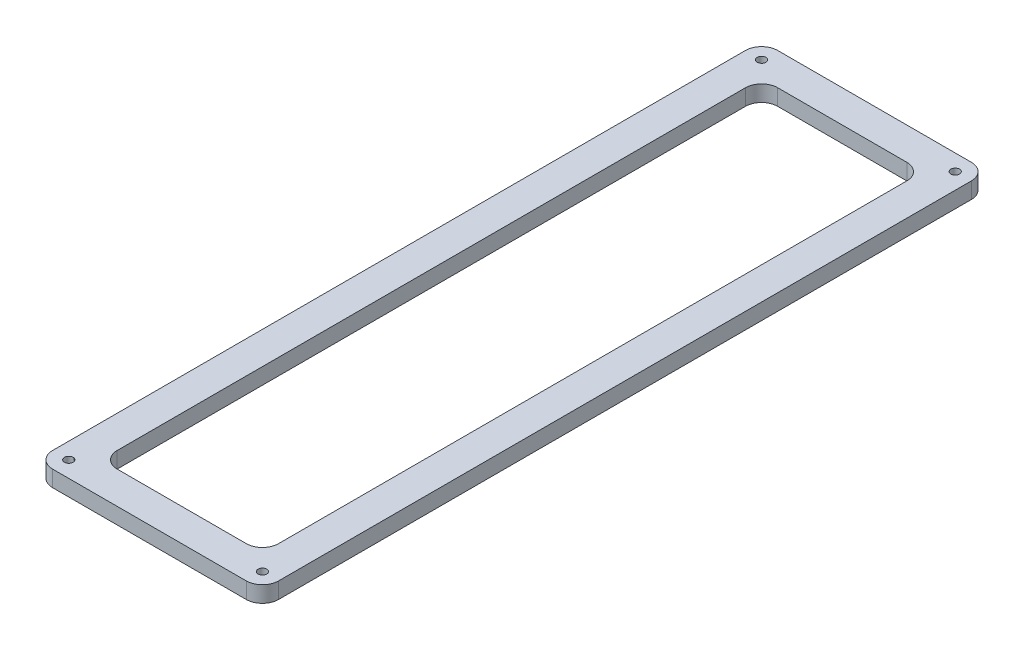
ISO-10303-21;
HEADER;
FILE_DESCRIPTION(('STEP AP214'),'2;1');
FILE_NAME('part.step','',(''),(''),'','','');
FILE_SCHEMA(('AUTOMOTIVE_DESIGN { 1 0 10303 214 1 1 1 1 }'));
ENDSEC;
DATA;
#1=APPLICATION_CONTEXT('core data for automotive mechanical design processes');
#2=APPLICATION_PROTOCOL_DEFINITION('international standard','automotive_design',2000,#1);
#3=PRODUCT_CONTEXT('',#1,'mechanical');
#4=PRODUCT('Part','Part','',(#3));
#5=PRODUCT_RELATED_PRODUCT_CATEGORY('part','',(#4));
#6=PRODUCT_DEFINITION_FORMATION('','',#4);
#7=PRODUCT_DEFINITION_CONTEXT('part definition',#1,'design');
#8=PRODUCT_DEFINITION('design','',#6,#7);
#9=PRODUCT_DEFINITION_SHAPE('','',#8);
#10=(LENGTH_UNIT() NAMED_UNIT(*) SI_UNIT(.MILLI.,.METRE.));
#11=(NAMED_UNIT(*) PLANE_ANGLE_UNIT() SI_UNIT($,.RADIAN.));
#12=(NAMED_UNIT(*) SI_UNIT($,.STERADIAN.) SOLID_ANGLE_UNIT());
#13=UNCERTAINTY_MEASURE_WITH_UNIT(LENGTH_MEASURE(1.E-05),#10,'distance_accuracy_value','');
#14=(GEOMETRIC_REPRESENTATION_CONTEXT(3) GLOBAL_UNCERTAINTY_ASSIGNED_CONTEXT((#13)) GLOBAL_UNIT_ASSIGNED_CONTEXT((#10,
#11,#12)) REPRESENTATION_CONTEXT('',''));
#15=CARTESIAN_POINT('',(0.,0.,0.));
#16=DIRECTION('',(0.,0.,1.));
#17=DIRECTION('',(1.,0.,0.));
#18=AXIS2_PLACEMENT_3D('',#15,#16,#17);
#19=CARTESIAN_POINT('',(0.,3.175,-136.313672));
#20=DIRECTION('',(0.,1.,0.));
#21=DIRECTION('',(0.,0.,1.));
#22=AXIS2_PLACEMENT_3D('',#19,#20,#21);
#23=PLANE('',#22);
#24=DIRECTION('',(-1.,0.,0.));
#25=VECTOR('',#24,1.);
#26=CARTESIAN_POINT('',(6.34999999999998,3.175,-133.138672));
#27=LINE('',#26,#25);
#28=CARTESIAN_POINT('',(31.75,3.175,-133.138672));
#29=VERTEX_POINT('',#28);
#30=CARTESIAN_POINT('',(6.34999999999998,3.175,-133.138672));
#31=VERTEX_POINT('',#30);
#32=EDGE_CURVE('E168',#29,#31,#27,.T.);
#33=ORIENTED_EDGE('',*,*,#32,.F.);
#34=CARTESIAN_POINT('',(31.75,3.175,-129.963672));
#35=DIRECTION('',(0.,1.,0.));
#36=DIRECTION('',(0.,0.,-1.));
#37=AXIS2_PLACEMENT_3D('',#34,#35,#36);
#38=CIRCLE('',#37,3.17500000000001);
#39=CARTESIAN_POINT('',(34.925,3.175,-129.963672));
#40=VERTEX_POINT('',#39);
#41=EDGE_CURVE('E159',#40,#29,#38,.T.);
#42=ORIENTED_EDGE('',*,*,#41,.F.);
#43=DIRECTION('',(0.,0.,-1.));
#44=VECTOR('',#43,1.);
#45=CARTESIAN_POINT('',(34.925,3.175,-129.963672));
#46=LINE('',#45,#44);
#47=CARTESIAN_POINT('',(34.925,3.175,-6.34999999999999));
#48=VERTEX_POINT('',#47);
#49=EDGE_CURVE('E202',#48,#40,#46,.T.);
#50=ORIENTED_EDGE('',*,*,#49,.F.);
#51=CARTESIAN_POINT('',(31.75,3.175,-6.35));
#52=DIRECTION('',(0.,1.,0.));
#53=DIRECTION('',(0.,0.,-1.));
#54=AXIS2_PLACEMENT_3D('',#51,#52,#53);
#55=CIRCLE('',#54,3.175);
#56=CARTESIAN_POINT('',(31.75,3.175,-3.175));
#57=VERTEX_POINT('',#56);
#58=EDGE_CURVE('E199',#57,#48,#55,.T.);
#59=ORIENTED_EDGE('',*,*,#58,.F.);
#60=DIRECTION('',(1.,0.,0.));
#61=VECTOR('',#60,1.);
#62=CARTESIAN_POINT('',(31.75,3.175,-3.175));
#63=LINE('',#62,#61);
#64=CARTESIAN_POINT('',(6.34999999999998,3.175,-3.175));
#65=VERTEX_POINT('',#64);
#66=EDGE_CURVE('E196',#65,#57,#63,.T.);
#67=ORIENTED_EDGE('',*,*,#66,.F.);
#68=CARTESIAN_POINT('',(6.34999999999998,3.175,-6.35));
#69=DIRECTION('',(0.,1.,0.));
#70=DIRECTION('',(0.,0.,-1.));
#71=AXIS2_PLACEMENT_3D('',#68,#69,#70);
#72=CIRCLE('',#71,3.175);
#73=CARTESIAN_POINT('',(3.17499999999998,3.175,-6.35));
#74=VERTEX_POINT('',#73);
#75=EDGE_CURVE('E193',#74,#65,#72,.T.);
#76=ORIENTED_EDGE('',*,*,#75,.F.);
#77=DIRECTION('',(0.,0.,1.));
#78=VECTOR('',#77,1.);
#79=CARTESIAN_POINT('',(3.17499999999998,3.175,-6.35));
#80=LINE('',#79,#78);
#81=CARTESIAN_POINT('',(3.17499999999998,3.175,-129.963672));
#82=VERTEX_POINT('',#81);
#83=EDGE_CURVE('E187',#82,#74,#80,.T.);
#84=ORIENTED_EDGE('',*,*,#83,.F.);
#85=CARTESIAN_POINT('',(6.34999999999998,3.175,-129.963672));
#86=DIRECTION('',(0.,1.,0.));
#87=DIRECTION('',(0.,0.,1.));
#88=AXIS2_PLACEMENT_3D('',#85,#86,#87);
#89=CIRCLE('',#88,3.17500000000001);
#90=EDGE_CURVE('E183',#31,#82,#89,.T.);
#91=ORIENTED_EDGE('',*,*,#90,.F.);
#92=EDGE_LOOP('',(#33,#42,#50,#59,#67,#76,#84,#91));
#93=FACE_BOUND('',#92,.T.);
#94=CARTESIAN_POINT('',(0.,3.175,0.));
#95=DIRECTION('',(0.,1.,0.));
#96=DIRECTION('',(0.,0.,1.));
#97=AXIS2_PLACEMENT_3D('',#94,#95,#96);
#98=CIRCLE('',#97,0.8509);
#99=CARTESIAN_POINT('',(0.,3.175,0.8509));
#100=VERTEX_POINT('',#99);
#101=EDGE_CURVE('E251',#100,#100,#98,.T.);
#102=ORIENTED_EDGE('',*,*,#101,.F.);
#103=EDGE_LOOP('',(#102));
#104=FACE_BOUND('',#103,.T.);
#105=CARTESIAN_POINT('',(0.,3.175,-136.313672));
#106=DIRECTION('',(0.,1.,0.));
#107=DIRECTION('',(0.,0.,1.));
#108=AXIS2_PLACEMENT_3D('',#105,#106,#107);
#109=CIRCLE('',#108,0.850900000000007);
#110=CARTESIAN_POINT('',(0.,3.175,-135.462772));
#111=VERTEX_POINT('',#110);
#112=EDGE_CURVE('E267',#111,#111,#109,.T.);
#113=ORIENTED_EDGE('',*,*,#112,.F.);
#114=EDGE_LOOP('',(#113));
#115=FACE_BOUND('',#114,.T.);
#116=CARTESIAN_POINT('',(0.,3.175,-136.313672));
#117=DIRECTION('',(0.,1.,0.));
#118=DIRECTION('',(0.,0.,1.));
#119=AXIS2_PLACEMENT_3D('',#116,#117,#118);
#120=CIRCLE('',#119,3.17499999999999);
#121=CARTESIAN_POINT('',(0.,3.175,-139.488672));
#122=VERTEX_POINT('',#121);
#123=CARTESIAN_POINT('',(-3.17500000000002,3.175,-136.313672));
#124=VERTEX_POINT('',#123);
#125=EDGE_CURVE('E275',#122,#124,#120,.T.);
#126=ORIENTED_EDGE('',*,*,#125,.T.);
#127=DIRECTION('',(0.,0.,1.));
#128=VECTOR('',#127,1.);
#129=CARTESIAN_POINT('',(-3.17500000000002,3.175,-136.313672));
#130=LINE('',#129,#128);
#131=CARTESIAN_POINT('',(-3.175,3.175,0.));
#132=VERTEX_POINT('',#131);
#133=EDGE_CURVE('E279',#124,#132,#130,.T.);
#134=ORIENTED_EDGE('',*,*,#133,.T.);
#135=CARTESIAN_POINT('',(0.,3.175,0.));
#136=DIRECTION('',(0.,1.,0.));
#137=DIRECTION('',(0.,0.,-1.));
#138=AXIS2_PLACEMENT_3D('',#135,#136,#137);
#139=CIRCLE('',#138,3.175);
#140=CARTESIAN_POINT('',(0.,3.175,3.175));
#141=VERTEX_POINT('',#140);
#142=EDGE_CURVE('E283',#132,#141,#139,.T.);
#143=ORIENTED_EDGE('',*,*,#142,.T.);
#144=DIRECTION('',(1.,0.,0.));
#145=VECTOR('',#144,1.);
#146=CARTESIAN_POINT('',(0.,3.175,3.175));
#147=LINE('',#146,#145);
#148=CARTESIAN_POINT('',(38.1,3.175,3.175));
#149=VERTEX_POINT('',#148);
#150=EDGE_CURVE('E286',#141,#149,#147,.T.);
#151=ORIENTED_EDGE('',*,*,#150,.T.);
#152=CARTESIAN_POINT('',(38.1,3.175,0.));
#153=DIRECTION('',(0.,1.,0.));
#154=DIRECTION('',(0.,0.,1.));
#155=AXIS2_PLACEMENT_3D('',#152,#153,#154);
#156=CIRCLE('',#155,3.175);
#157=CARTESIAN_POINT('',(41.275,3.175,0.));
#158=VERTEX_POINT('',#157);
#159=EDGE_CURVE('E289',#149,#158,#156,.T.);
#160=ORIENTED_EDGE('',*,*,#159,.T.);
#161=DIRECTION('',(0.,0.,-1.));
#162=VECTOR('',#161,1.);
#163=CARTESIAN_POINT('',(41.275,3.175,0.));
#164=LINE('',#163,#162);
#165=CARTESIAN_POINT('',(41.275,3.175,-136.313672));
#166=VERTEX_POINT('',#165);
#167=EDGE_CURVE('E292',#158,#166,#164,.T.);
#168=ORIENTED_EDGE('',*,*,#167,.T.);
#169=CARTESIAN_POINT('',(38.1,3.175,-136.313672));
#170=DIRECTION('',(0.,1.,0.));
#171=DIRECTION('',(0.,0.,1.));
#172=AXIS2_PLACEMENT_3D('',#169,#170,#171);
#173=CIRCLE('',#172,3.17499999999999);
#174=CARTESIAN_POINT('',(38.1,3.175,-139.488672));
#175=VERTEX_POINT('',#174);
#176=EDGE_CURVE('E295',#166,#175,#173,.T.);
#177=ORIENTED_EDGE('',*,*,#176,.T.);
#178=DIRECTION('',(-1.,0.,0.));
#179=VECTOR('',#178,1.);
#180=CARTESIAN_POINT('',(38.1,3.175,-139.488672));
#181=LINE('',#180,#179);
#182=EDGE_CURVE('E298',#175,#122,#181,.T.);
#183=ORIENTED_EDGE('',*,*,#182,.T.);
#184=EDGE_LOOP('',(#126,#134,#143,#151,#160,#168,#177,#183));
#185=FACE_BOUND('',#184,.T.);
#186=CARTESIAN_POINT('',(38.1,3.175,-136.313672));
#187=DIRECTION('',(0.,1.,0.));
#188=DIRECTION('',(0.,0.,1.));
#189=AXIS2_PLACEMENT_3D('',#186,#187,#188);
#190=CIRCLE('',#189,0.850900000000003);
#191=CARTESIAN_POINT('',(38.1,3.175,-135.462772));
#192=VERTEX_POINT('',#191);
#193=EDGE_CURVE('E259',#192,#192,#190,.T.);
#194=ORIENTED_EDGE('',*,*,#193,.F.);
#195=EDGE_LOOP('',(#194));
#196=FACE_BOUND('',#195,.T.);
#197=CARTESIAN_POINT('',(38.1,3.175,0.));
#198=DIRECTION('',(0.,1.,0.));
#199=DIRECTION('',(0.,0.,1.));
#200=AXIS2_PLACEMENT_3D('',#197,#198,#199);
#201=CIRCLE('',#200,0.850899999999999);
#202=CARTESIAN_POINT('',(38.1,3.175,0.850899999999999));
#203=VERTEX_POINT('',#202);
#204=EDGE_CURVE('E207',#203,#203,#201,.T.);
#205=ORIENTED_EDGE('',*,*,#204,.F.);
#206=EDGE_LOOP('',(#205));
#207=FACE_BOUND('',#206,.T.);
#208=ADVANCED_FACE('F45',(#93,#104,#115,#185,#196,#207),#23,.T.);
#209=CARTESIAN_POINT('',(0.,0.,-136.313672));
#210=DIRECTION('',(0.,1.,0.));
#211=DIRECTION('',(0.,0.,1.));
#212=AXIS2_PLACEMENT_3D('',#209,#210,#211);
#213=PLANE('',#212);
#214=CARTESIAN_POINT('',(0.,0.,0.));
#215=DIRECTION('',(0.,1.,0.));
#216=DIRECTION('',(0.,0.,1.));
#217=AXIS2_PLACEMENT_3D('',#214,#215,#216);
#218=CIRCLE('',#217,0.8509);
#219=CARTESIAN_POINT('',(0.,0.,0.8509));
#220=VERTEX_POINT('',#219);
#221=EDGE_CURVE('E177',#220,#220,#218,.T.);
#222=ORIENTED_EDGE('',*,*,#221,.T.);
#223=EDGE_LOOP('',(#222));
#224=FACE_BOUND('',#223,.T.);
#225=CARTESIAN_POINT('',(38.1,0.,-136.313672));
#226=DIRECTION('',(0.,1.,0.));
#227=DIRECTION('',(0.,0.,1.));
#228=AXIS2_PLACEMENT_3D('',#225,#226,#227);
#229=CIRCLE('',#228,0.850900000000003);
#230=CARTESIAN_POINT('',(38.1,0.,-135.462772));
#231=VERTEX_POINT('',#230);
#232=EDGE_CURVE('E255',#231,#231,#229,.T.);
#233=ORIENTED_EDGE('',*,*,#232,.T.);
#234=EDGE_LOOP('',(#233));
#235=FACE_BOUND('',#234,.T.);
#236=CARTESIAN_POINT('',(0.,0.,-136.313672));
#237=DIRECTION('',(0.,1.,0.));
#238=DIRECTION('',(0.,0.,1.));
#239=AXIS2_PLACEMENT_3D('',#236,#237,#238);
#240=CIRCLE('',#239,0.850900000000007);
#241=CARTESIAN_POINT('',(0.,0.,-135.462772));
#242=VERTEX_POINT('',#241);
#243=EDGE_CURVE('E263',#242,#242,#240,.T.);
#244=ORIENTED_EDGE('',*,*,#243,.T.);
#245=EDGE_LOOP('',(#244));
#246=FACE_BOUND('',#245,.T.);
#247=CARTESIAN_POINT('',(0.,0.,-136.313672));
#248=DIRECTION('',(0.,1.,0.));
#249=DIRECTION('',(0.,0.,1.));
#250=AXIS2_PLACEMENT_3D('',#247,#248,#249);
#251=CIRCLE('',#250,3.17499999999999);
#252=CARTESIAN_POINT('',(0.,0.,-139.488672));
#253=VERTEX_POINT('',#252);
#254=CARTESIAN_POINT('',(-3.17500000000002,0.,-136.313672));
#255=VERTEX_POINT('',#254);
#256=EDGE_CURVE('E271',#253,#255,#251,.T.);
#257=ORIENTED_EDGE('',*,*,#256,.F.);
#258=DIRECTION('',(-1.,0.,0.));
#259=VECTOR('',#258,1.);
#260=CARTESIAN_POINT('',(38.1,0.,-139.488672));
#261=LINE('',#260,#259);
#262=CARTESIAN_POINT('',(38.1,0.,-139.488672));
#263=VERTEX_POINT('',#262);
#264=EDGE_CURVE('E280',#263,#253,#261,.T.);
#265=ORIENTED_EDGE('',*,*,#264,.F.);
#266=CARTESIAN_POINT('',(38.1,0.,-136.313672));
#267=DIRECTION('',(0.,1.,0.));
#268=DIRECTION('',(0.,0.,1.));
#269=AXIS2_PLACEMENT_3D('',#266,#267,#268);
#270=CIRCLE('',#269,3.17499999999999);
#271=CARTESIAN_POINT('',(41.275,0.,-136.313672));
#272=VERTEX_POINT('',#271);
#273=EDGE_CURVE('E320',#272,#263,#270,.T.);
#274=ORIENTED_EDGE('',*,*,#273,.F.);
#275=DIRECTION('',(0.,0.,-1.));
#276=VECTOR('',#275,1.);
#277=CARTESIAN_POINT('',(41.275,0.,0.));
#278=LINE('',#277,#276);
#279=CARTESIAN_POINT('',(41.275,0.,0.));
#280=VERTEX_POINT('',#279);
#281=EDGE_CURVE('E317',#280,#272,#278,.T.);
#282=ORIENTED_EDGE('',*,*,#281,.F.);
#283=CARTESIAN_POINT('',(38.1,0.,0.));
#284=DIRECTION('',(0.,1.,0.));
#285=DIRECTION('',(0.,0.,1.));
#286=AXIS2_PLACEMENT_3D('',#283,#284,#285);
#287=CIRCLE('',#286,3.175);
#288=CARTESIAN_POINT('',(38.1,0.,3.175));
#289=VERTEX_POINT('',#288);
#290=EDGE_CURVE('E314',#289,#280,#287,.T.);
#291=ORIENTED_EDGE('',*,*,#290,.F.);
#292=DIRECTION('',(1.,0.,0.));
#293=VECTOR('',#292,1.);
#294=CARTESIAN_POINT('',(0.,0.,3.175));
#295=LINE('',#294,#293);
#296=CARTESIAN_POINT('',(0.,0.,3.175));
#297=VERTEX_POINT('',#296);
#298=EDGE_CURVE('E311',#297,#289,#295,.T.);
#299=ORIENTED_EDGE('',*,*,#298,.F.);
#300=CARTESIAN_POINT('',(0.,0.,0.));
#301=DIRECTION('',(0.,1.,0.));
#302=DIRECTION('',(0.,0.,-1.));
#303=AXIS2_PLACEMENT_3D('',#300,#301,#302);
#304=CIRCLE('',#303,3.175);
#305=CARTESIAN_POINT('',(-3.175,0.,0.));
#306=VERTEX_POINT('',#305);
#307=EDGE_CURVE('E308',#306,#297,#304,.T.);
#308=ORIENTED_EDGE('',*,*,#307,.F.);
#309=DIRECTION('',(0.,0.,1.));
#310=VECTOR('',#309,1.);
#311=CARTESIAN_POINT('',(-3.17500000000002,0.,-136.313672));
#312=LINE('',#311,#310);
#313=EDGE_CURVE('E305',#255,#306,#312,.T.);
#314=ORIENTED_EDGE('',*,*,#313,.F.);
#315=EDGE_LOOP('',(#257,#265,#274,#282,#291,#299,#308,#314));
#316=FACE_BOUND('',#315,.T.);
#317=CARTESIAN_POINT('',(31.75,0.,-129.963672));
#318=DIRECTION('',(0.,1.,0.));
#319=DIRECTION('',(0.,0.,-1.));
#320=AXIS2_PLACEMENT_3D('',#317,#318,#319);
#321=CIRCLE('',#320,3.17500000000001);
#322=CARTESIAN_POINT('',(34.925,0.,-129.963672));
#323=VERTEX_POINT('',#322);
#324=CARTESIAN_POINT('',(31.75,0.,-133.138672));
#325=VERTEX_POINT('',#324);
#326=EDGE_CURVE('E69',#323,#325,#321,.T.);
#327=ORIENTED_EDGE('',*,*,#326,.T.);
#328=DIRECTION('',(-1.,0.,0.));
#329=VECTOR('',#328,1.);
#330=CARTESIAN_POINT('',(6.34999999999998,0.,-133.138672));
#331=LINE('',#330,#329);
#332=CARTESIAN_POINT('',(6.34999999999998,0.,-133.138672));
#333=VERTEX_POINT('',#332);
#334=EDGE_CURVE('E175',#325,#333,#331,.T.);
#335=ORIENTED_EDGE('',*,*,#334,.T.);
#336=CARTESIAN_POINT('',(6.34999999999998,0.,-129.963672));
#337=DIRECTION('',(0.,1.,0.));
#338=DIRECTION('',(0.,0.,1.));
#339=AXIS2_PLACEMENT_3D('',#336,#337,#338);
#340=CIRCLE('',#339,3.17500000000001);
#341=CARTESIAN_POINT('',(3.17499999999998,0.,-129.963672));
#342=VERTEX_POINT('',#341);
#343=EDGE_CURVE('E210',#333,#342,#340,.T.);
#344=ORIENTED_EDGE('',*,*,#343,.T.);
#345=DIRECTION('',(0.,0.,1.));
#346=VECTOR('',#345,1.);
#347=CARTESIAN_POINT('',(3.17499999999998,0.,-6.35));
#348=LINE('',#347,#346);
#349=CARTESIAN_POINT('',(3.17499999999998,0.,-6.35));
#350=VERTEX_POINT('',#349);
#351=EDGE_CURVE('E214',#342,#350,#348,.T.);
#352=ORIENTED_EDGE('',*,*,#351,.T.);
#353=CARTESIAN_POINT('',(6.34999999999998,0.,-6.35));
#354=DIRECTION('',(0.,1.,0.));
#355=DIRECTION('',(0.,0.,-1.));
#356=AXIS2_PLACEMENT_3D('',#353,#354,#355);
#357=CIRCLE('',#356,3.175);
#358=CARTESIAN_POINT('',(6.34999999999998,0.,-3.175));
#359=VERTEX_POINT('',#358);
#360=EDGE_CURVE('E218',#350,#359,#357,.T.);
#361=ORIENTED_EDGE('',*,*,#360,.T.);
#362=DIRECTION('',(1.,0.,0.));
#363=VECTOR('',#362,1.);
#364=CARTESIAN_POINT('',(31.75,0.,-3.175));
#365=LINE('',#364,#363);
#366=CARTESIAN_POINT('',(31.75,0.,-3.175));
#367=VERTEX_POINT('',#366);
#368=EDGE_CURVE('E222',#359,#367,#365,.T.);
#369=ORIENTED_EDGE('',*,*,#368,.T.);
#370=CARTESIAN_POINT('',(31.75,0.,-6.35));
#371=DIRECTION('',(0.,1.,0.));
#372=DIRECTION('',(0.,0.,-1.));
#373=AXIS2_PLACEMENT_3D('',#370,#371,#372);
#374=CIRCLE('',#373,3.175);
#375=CARTESIAN_POINT('',(34.925,0.,-6.35));
#376=VERTEX_POINT('',#375);
#377=EDGE_CURVE('E226',#367,#376,#374,.T.);
#378=ORIENTED_EDGE('',*,*,#377,.T.);
#379=DIRECTION('',(0.,0.,-1.));
#380=VECTOR('',#379,1.);
#381=CARTESIAN_POINT('',(34.925,0.,-129.963672));
#382=LINE('',#381,#380);
#383=EDGE_CURVE('E169',#376,#323,#382,.T.);
#384=ORIENTED_EDGE('',*,*,#383,.T.);
#385=EDGE_LOOP('',(#327,#335,#344,#352,#361,#369,#378,#384));
#386=FACE_BOUND('',#385,.T.);
#387=CARTESIAN_POINT('',(38.1,0.,0.));
#388=DIRECTION('',(0.,1.,0.));
#389=DIRECTION('',(0.,0.,1.));
#390=AXIS2_PLACEMENT_3D('',#387,#388,#389);
#391=CIRCLE('',#390,0.850899999999999);
#392=CARTESIAN_POINT('',(38.1,0.,0.850899999999999));
#393=VERTEX_POINT('',#392);
#394=EDGE_CURVE('E470',#393,#393,#391,.T.);
#395=ORIENTED_EDGE('',*,*,#394,.T.);
#396=EDGE_LOOP('',(#395));
#397=FACE_BOUND('',#396,.T.);
#398=ADVANCED_FACE('F359',(#224,#235,#246,#316,#386,#397),#213,.F.);
#399=CARTESIAN_POINT('',(0.,3.175,-136.313672));
#400=DIRECTION('',(0.,-1.,0.));
#401=DIRECTION('',(0.,0.,-1.));
#402=AXIS2_PLACEMENT_3D('',#399,#400,#401);
#403=CYLINDRICAL_SURFACE('',#402,3.17499999999999);
#404=ORIENTED_EDGE('',*,*,#256,.T.);
#405=DIRECTION('',(0.,-1.,0.));
#406=VECTOR('',#405,1.);
#407=CARTESIAN_POINT('',(-3.17500000000002,3.175,-136.313672));
#408=LINE('',#407,#406);
#409=EDGE_CURVE('E11',#124,#255,#408,.T.);
#410=ORIENTED_EDGE('',*,*,#409,.F.);
#411=ORIENTED_EDGE('',*,*,#125,.F.);
#412=DIRECTION('',(0.,-1.,0.));
#413=VECTOR('',#412,1.);
#414=CARTESIAN_POINT('',(0.,3.175,-139.488672));
#415=LINE('',#414,#413);
#416=EDGE_CURVE('E301',#122,#253,#415,.T.);
#417=ORIENTED_EDGE('',*,*,#416,.T.);
#418=EDGE_LOOP('',(#404,#410,#411,#417));
#419=FACE_BOUND('',#418,.T.);
#420=ADVANCED_FACE('F47',(#419),#403,.T.);
#421=CARTESIAN_POINT('',(-3.17500000000002,3.175,-136.313672));
#422=DIRECTION('',(1.,0.,0.));
#423=DIRECTION('',(0.,0.,-1.));
#424=AXIS2_PLACEMENT_3D('',#421,#422,#423);
#425=PLANE('',#424);
#426=ORIENTED_EDGE('',*,*,#313,.T.);
#427=DIRECTION('',(0.,-1.,0.));
#428=VECTOR('',#427,1.);
#429=CARTESIAN_POINT('',(-3.175,3.175,0.));
#430=LINE('',#429,#428);
#431=EDGE_CURVE('E54',#132,#306,#430,.T.);
#432=ORIENTED_EDGE('',*,*,#431,.F.);
#433=ORIENTED_EDGE('',*,*,#133,.F.);
#434=ORIENTED_EDGE('',*,*,#409,.T.);
#435=EDGE_LOOP('',(#426,#432,#433,#434));
#436=FACE_BOUND('',#435,.T.);
#437=ADVANCED_FACE('F377',(#436),#425,.F.);
#438=CARTESIAN_POINT('',(0.,3.175,0.));
#439=DIRECTION('',(0.,-1.,0.));
#440=DIRECTION('',(0.,0.,-1.));
#441=AXIS2_PLACEMENT_3D('',#438,#439,#440);
#442=CYLINDRICAL_SURFACE('',#441,3.175);
#443=ORIENTED_EDGE('',*,*,#307,.T.);
#444=DIRECTION('',(0.,-1.,0.));
#445=VECTOR('',#444,1.);
#446=CARTESIAN_POINT('',(0.,3.175,3.175));
#447=LINE('',#446,#445);
#448=EDGE_CURVE('E344',#141,#297,#447,.T.);
#449=ORIENTED_EDGE('',*,*,#448,.F.);
#450=ORIENTED_EDGE('',*,*,#142,.F.);
#451=ORIENTED_EDGE('',*,*,#431,.T.);
#452=EDGE_LOOP('',(#443,#449,#450,#451));
#453=FACE_BOUND('',#452,.T.);
#454=ADVANCED_FACE('F353',(#453),#442,.T.);
#455=CARTESIAN_POINT('',(0.,3.175,3.175));
#456=DIRECTION('',(0.,0.,-1.));
#457=DIRECTION('',(-1.,0.,0.));
#458=AXIS2_PLACEMENT_3D('',#455,#456,#457);
#459=PLANE('',#458);
#460=ORIENTED_EDGE('',*,*,#298,.T.);
#461=DIRECTION('',(0.,-1.,0.));
#462=VECTOR('',#461,1.);
#463=CARTESIAN_POINT('',(38.1,3.175,3.175));
#464=LINE('',#463,#462);
#465=EDGE_CURVE('E340',#149,#289,#464,.T.);
#466=ORIENTED_EDGE('',*,*,#465,.F.);
#467=ORIENTED_EDGE('',*,*,#150,.F.);
#468=ORIENTED_EDGE('',*,*,#448,.T.);
#469=EDGE_LOOP('',(#460,#466,#467,#468));
#470=FACE_BOUND('',#469,.T.);
#471=ADVANCED_FACE('F365',(#470),#459,.F.);
#472=CARTESIAN_POINT('',(38.1,3.175,0.));
#473=DIRECTION('',(0.,-1.,0.));
#474=DIRECTION('',(0.,0.,-1.));
#475=AXIS2_PLACEMENT_3D('',#472,#473,#474);
#476=CYLINDRICAL_SURFACE('',#475,3.175);
#477=ORIENTED_EDGE('',*,*,#290,.T.);
#478=DIRECTION('',(0.,-1.,0.));
#479=VECTOR('',#478,1.);
#480=CARTESIAN_POINT('',(41.275,3.175,0.));
#481=LINE('',#480,#479);
#482=EDGE_CURVE('E336',#158,#280,#481,.T.);
#483=ORIENTED_EDGE('',*,*,#482,.F.);
#484=ORIENTED_EDGE('',*,*,#159,.F.);
#485=ORIENTED_EDGE('',*,*,#465,.T.);
#486=EDGE_LOOP('',(#477,#483,#484,#485));
#487=FACE_BOUND('',#486,.T.);
#488=ADVANCED_FACE('F369',(#487),#476,.T.);
#489=CARTESIAN_POINT('',(41.275,3.175,0.));
#490=DIRECTION('',(-1.,0.,0.));
#491=DIRECTION('',(0.,0.,1.));
#492=AXIS2_PLACEMENT_3D('',#489,#490,#491);
#493=PLANE('',#492);
#494=ORIENTED_EDGE('',*,*,#281,.T.);
#495=DIRECTION('',(0.,-1.,0.));
#496=VECTOR('',#495,1.);
#497=CARTESIAN_POINT('',(41.275,3.175,-136.313672));
#498=LINE('',#497,#496);
#499=EDGE_CURVE('E332',#166,#272,#498,.T.);
#500=ORIENTED_EDGE('',*,*,#499,.F.);
#501=ORIENTED_EDGE('',*,*,#167,.F.);
#502=ORIENTED_EDGE('',*,*,#482,.T.);
#503=EDGE_LOOP('',(#494,#500,#501,#502));
#504=FACE_BOUND('',#503,.T.);
#505=ADVANCED_FACE('F390',(#504),#493,.F.);
#506=CARTESIAN_POINT('',(38.1,3.175,-136.313672));
#507=DIRECTION('',(0.,-1.,0.));
#508=DIRECTION('',(0.,0.,-1.));
#509=AXIS2_PLACEMENT_3D('',#506,#507,#508);
#510=CYLINDRICAL_SURFACE('',#509,3.17499999999999);
#511=ORIENTED_EDGE('',*,*,#273,.T.);
#512=DIRECTION('',(0.,-1.,0.));
#513=VECTOR('',#512,1.);
#514=CARTESIAN_POINT('',(38.1,3.175,-139.488672));
#515=LINE('',#514,#513);
#516=EDGE_CURVE('E328',#175,#263,#515,.T.);
#517=ORIENTED_EDGE('',*,*,#516,.F.);
#518=ORIENTED_EDGE('',*,*,#176,.F.);
#519=ORIENTED_EDGE('',*,*,#499,.T.);
#520=EDGE_LOOP('',(#511,#517,#518,#519));
#521=FACE_BOUND('',#520,.T.);
#522=ADVANCED_FACE('F388',(#521),#510,.T.);
#523=CARTESIAN_POINT('',(38.1,3.175,-139.488672));
#524=DIRECTION('',(0.,0.,1.));
#525=DIRECTION('',(1.,0.,0.));
#526=AXIS2_PLACEMENT_3D('',#523,#524,#525);
#527=PLANE('',#526);
#528=ORIENTED_EDGE('',*,*,#264,.T.);
#529=ORIENTED_EDGE('',*,*,#416,.F.);
#530=ORIENTED_EDGE('',*,*,#182,.F.);
#531=ORIENTED_EDGE('',*,*,#516,.T.);
#532=EDGE_LOOP('',(#528,#529,#530,#531));
#533=FACE_BOUND('',#532,.T.);
#534=ADVANCED_FACE('F383',(#533),#527,.F.);
#535=CARTESIAN_POINT('',(0.,3.175,-136.313672));
#536=DIRECTION('',(0.,-1.,0.));
#537=DIRECTION('',(0.,0.,-1.));
#538=AXIS2_PLACEMENT_3D('',#535,#536,#537);
#539=CYLINDRICAL_SURFACE('',#538,0.850900000000007);
#540=ORIENTED_EDGE('',*,*,#112,.T.);
#541=EDGE_LOOP('',(#540));
#542=FACE_BOUND('',#541,.T.);
#543=ORIENTED_EDGE('',*,*,#243,.F.);
#544=EDGE_LOOP('',(#543));
#545=FACE_BOUND('',#544,.T.);
#546=ADVANCED_FACE('F407',(#542,#545),#539,.F.);
#547=CARTESIAN_POINT('',(38.1,3.175,-136.313672));
#548=DIRECTION('',(0.,-1.,0.));
#549=DIRECTION('',(0.,0.,-1.));
#550=AXIS2_PLACEMENT_3D('',#547,#548,#549);
#551=CYLINDRICAL_SURFACE('',#550,0.850900000000003);
#552=ORIENTED_EDGE('',*,*,#193,.T.);
#553=EDGE_LOOP('',(#552));
#554=FACE_BOUND('',#553,.T.);
#555=ORIENTED_EDGE('',*,*,#232,.F.);
#556=EDGE_LOOP('',(#555));
#557=FACE_BOUND('',#556,.T.);
#558=ADVANCED_FACE('F414',(#554,#557),#551,.F.);
#559=CARTESIAN_POINT('',(0.,3.175,0.));
#560=DIRECTION('',(0.,-1.,0.));
#561=DIRECTION('',(0.,0.,-1.));
#562=AXIS2_PLACEMENT_3D('',#559,#560,#561);
#563=CYLINDRICAL_SURFACE('',#562,0.8509);
#564=ORIENTED_EDGE('',*,*,#101,.T.);
#565=EDGE_LOOP('',(#564));
#566=FACE_BOUND('',#565,.T.);
#567=ORIENTED_EDGE('',*,*,#221,.F.);
#568=EDGE_LOOP('',(#567));
#569=FACE_BOUND('',#568,.T.);
#570=ADVANCED_FACE('F419',(#566,#569),#563,.F.);
#571=CARTESIAN_POINT('',(31.75,3.175,-129.963672));
#572=DIRECTION('',(0.,-1.,0.));
#573=DIRECTION('',(0.,0.,-1.));
#574=AXIS2_PLACEMENT_3D('',#571,#572,#573);
#575=CYLINDRICAL_SURFACE('',#574,3.17500000000001);
#576=ORIENTED_EDGE('',*,*,#326,.F.);
#577=DIRECTION('',(0.,-1.,0.));
#578=VECTOR('',#577,1.);
#579=CARTESIAN_POINT('',(34.925,3.175,-129.963672));
#580=LINE('',#579,#578);
#581=EDGE_CURVE('E163',#40,#323,#580,.T.);
#582=ORIENTED_EDGE('',*,*,#581,.F.);
#583=ORIENTED_EDGE('',*,*,#41,.T.);
#584=DIRECTION('',(0.,-1.,0.));
#585=VECTOR('',#584,1.);
#586=CARTESIAN_POINT('',(31.75,3.175,-133.138672));
#587=LINE('',#586,#585);
#588=EDGE_CURVE('E162',#29,#325,#587,.T.);
#589=ORIENTED_EDGE('',*,*,#588,.T.);
#590=EDGE_LOOP('',(#576,#582,#583,#589));
#591=FACE_BOUND('',#590,.T.);
#592=ADVANCED_FACE('F161',(#591),#575,.F.);
#593=CARTESIAN_POINT('',(6.34999999999998,3.175,-133.138672));
#594=DIRECTION('',(0.,0.,1.));
#595=DIRECTION('',(1.,0.,0.));
#596=AXIS2_PLACEMENT_3D('',#593,#594,#595);
#597=PLANE('',#596);
#598=ORIENTED_EDGE('',*,*,#334,.F.);
#599=ORIENTED_EDGE('',*,*,#588,.F.);
#600=ORIENTED_EDGE('',*,*,#32,.T.);
#601=DIRECTION('',(0.,-1.,0.));
#602=VECTOR('',#601,1.);
#603=CARTESIAN_POINT('',(6.34999999999998,3.175,-133.138672));
#604=LINE('',#603,#602);
#605=EDGE_CURVE('E178',#31,#333,#604,.T.);
#606=ORIENTED_EDGE('',*,*,#605,.T.);
#607=EDGE_LOOP('',(#598,#599,#600,#606));
#608=FACE_BOUND('',#607,.T.);
#609=ADVANCED_FACE('F172',(#608),#597,.T.);
#610=CARTESIAN_POINT('',(6.34999999999998,3.175,-129.963672));
#611=DIRECTION('',(0.,-1.,0.));
#612=DIRECTION('',(0.,0.,-1.));
#613=AXIS2_PLACEMENT_3D('',#610,#611,#612);
#614=CYLINDRICAL_SURFACE('',#613,3.17500000000001);
#615=ORIENTED_EDGE('',*,*,#343,.F.);
#616=ORIENTED_EDGE('',*,*,#605,.F.);
#617=ORIENTED_EDGE('',*,*,#90,.T.);
#618=DIRECTION('',(0.,-1.,0.));
#619=VECTOR('',#618,1.);
#620=CARTESIAN_POINT('',(3.17499999999998,3.175,-129.963672));
#621=LINE('',#620,#619);
#622=EDGE_CURVE('E246',#82,#342,#621,.T.);
#623=ORIENTED_EDGE('',*,*,#622,.T.);
#624=EDGE_LOOP('',(#615,#616,#617,#623));
#625=FACE_BOUND('',#624,.T.);
#626=ADVANCED_FACE('F437',(#625),#614,.F.);
#627=CARTESIAN_POINT('',(3.17499999999998,3.175,-6.35));
#628=DIRECTION('',(1.,0.,0.));
#629=DIRECTION('',(0.,0.,-1.));
#630=AXIS2_PLACEMENT_3D('',#627,#628,#629);
#631=PLANE('',#630);
#632=ORIENTED_EDGE('',*,*,#351,.F.);
#633=ORIENTED_EDGE('',*,*,#622,.F.);
#634=ORIENTED_EDGE('',*,*,#83,.T.);
#635=DIRECTION('',(0.,-1.,0.));
#636=VECTOR('',#635,1.);
#637=CARTESIAN_POINT('',(3.17499999999998,3.175,-6.35));
#638=LINE('',#637,#636);
#639=EDGE_CURVE('E243',#74,#350,#638,.T.);
#640=ORIENTED_EDGE('',*,*,#639,.T.);
#641=EDGE_LOOP('',(#632,#633,#634,#640));
#642=FACE_BOUND('',#641,.T.);
#643=ADVANCED_FACE('F440',(#642),#631,.T.);
#644=CARTESIAN_POINT('',(6.34999999999998,3.175,-6.35));
#645=DIRECTION('',(0.,-1.,0.));
#646=DIRECTION('',(0.,0.,-1.));
#647=AXIS2_PLACEMENT_3D('',#644,#645,#646);
#648=CYLINDRICAL_SURFACE('',#647,3.175);
#649=ORIENTED_EDGE('',*,*,#360,.F.);
#650=ORIENTED_EDGE('',*,*,#639,.F.);
#651=ORIENTED_EDGE('',*,*,#75,.T.);
#652=DIRECTION('',(0.,-1.,0.));
#653=VECTOR('',#652,1.);
#654=CARTESIAN_POINT('',(6.34999999999998,3.175,-3.175));
#655=LINE('',#654,#653);
#656=EDGE_CURVE('E240',#65,#359,#655,.T.);
#657=ORIENTED_EDGE('',*,*,#656,.T.);
#658=EDGE_LOOP('',(#649,#650,#651,#657));
#659=FACE_BOUND('',#658,.T.);
#660=ADVANCED_FACE('F444',(#659),#648,.F.);
#661=CARTESIAN_POINT('',(31.75,3.175,-3.175));
#662=DIRECTION('',(0.,0.,-1.));
#663=DIRECTION('',(-1.,0.,0.));
#664=AXIS2_PLACEMENT_3D('',#661,#662,#663);
#665=PLANE('',#664);
#666=ORIENTED_EDGE('',*,*,#368,.F.);
#667=ORIENTED_EDGE('',*,*,#656,.F.);
#668=ORIENTED_EDGE('',*,*,#66,.T.);
#669=DIRECTION('',(0.,-1.,0.));
#670=VECTOR('',#669,1.);
#671=CARTESIAN_POINT('',(31.75,3.175,-3.175));
#672=LINE('',#671,#670);
#673=EDGE_CURVE('E237',#57,#367,#672,.T.);
#674=ORIENTED_EDGE('',*,*,#673,.T.);
#675=EDGE_LOOP('',(#666,#667,#668,#674));
#676=FACE_BOUND('',#675,.T.);
#677=ADVANCED_FACE('F448',(#676),#665,.T.);
#678=CARTESIAN_POINT('',(31.75,3.175,-6.35));
#679=DIRECTION('',(0.,-1.,0.));
#680=DIRECTION('',(0.,0.,-1.));
#681=AXIS2_PLACEMENT_3D('',#678,#679,#680);
#682=CYLINDRICAL_SURFACE('',#681,3.175);
#683=ORIENTED_EDGE('',*,*,#377,.F.);
#684=ORIENTED_EDGE('',*,*,#673,.F.);
#685=ORIENTED_EDGE('',*,*,#58,.T.);
#686=DIRECTION('',(0.,-1.,0.));
#687=VECTOR('',#686,1.);
#688=CARTESIAN_POINT('',(34.925,3.175,-6.35));
#689=LINE('',#688,#687);
#690=EDGE_CURVE('E61',#48,#376,#689,.T.);
#691=ORIENTED_EDGE('',*,*,#690,.T.);
#692=EDGE_LOOP('',(#683,#684,#685,#691));
#693=FACE_BOUND('',#692,.T.);
#694=ADVANCED_FACE('F452',(#693),#682,.F.);
#695=CARTESIAN_POINT('',(34.925,3.175,-129.963672));
#696=DIRECTION('',(-1.,0.,0.));
#697=DIRECTION('',(0.,0.,1.));
#698=AXIS2_PLACEMENT_3D('',#695,#696,#697);
#699=PLANE('',#698);
#700=ORIENTED_EDGE('',*,*,#383,.F.);
#701=ORIENTED_EDGE('',*,*,#690,.F.);
#702=ORIENTED_EDGE('',*,*,#49,.T.);
#703=ORIENTED_EDGE('',*,*,#581,.T.);
#704=EDGE_LOOP('',(#700,#701,#702,#703));
#705=FACE_BOUND('',#704,.T.);
#706=ADVANCED_FACE('F456',(#705),#699,.T.);
#707=CARTESIAN_POINT('',(38.1,3.175,0.));
#708=DIRECTION('',(0.,-1.,0.));
#709=DIRECTION('',(0.,0.,-1.));
#710=AXIS2_PLACEMENT_3D('',#707,#708,#709);
#711=CYLINDRICAL_SURFACE('',#710,0.850899999999999);
#712=ORIENTED_EDGE('',*,*,#204,.T.);
#713=EDGE_LOOP('',(#712));
#714=FACE_BOUND('',#713,.T.);
#715=ORIENTED_EDGE('',*,*,#394,.F.);
#716=EDGE_LOOP('',(#715));
#717=FACE_BOUND('',#716,.T.);
#718=ADVANCED_FACE('F460',(#714,#717),#711,.F.);
#719=CLOSED_SHELL('',(#208,#398,#420,#437,#454,#471,#488,#505,#522,#534,#546,#558,#570,#592,
#609,#626,#643,#660,#677,#694,#706,#718));
#720=MANIFOLD_SOLID_BREP('B2',#719);
#721=ADVANCED_BREP_SHAPE_REPRESENTATION('',(#18,#720),#14);
#722=SHAPE_DEFINITION_REPRESENTATION(#9,#721);
ENDSEC;
END-ISO-10303-21;
